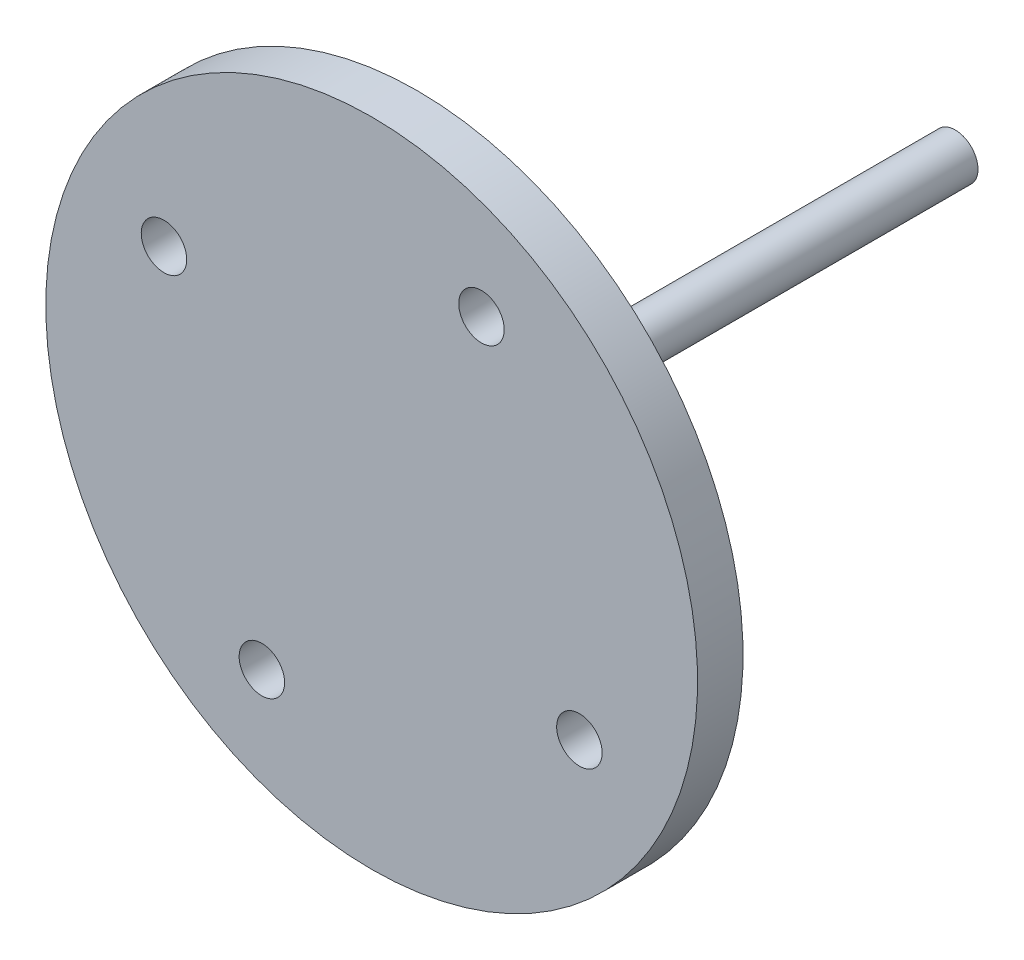
ISO-10303-21;
HEADER;
FILE_DESCRIPTION(('STEP AP214'),'2;1');
FILE_NAME('part.step','',(''),(''),'','','');
FILE_SCHEMA(('AUTOMOTIVE_DESIGN { 1 0 10303 214 1 1 1 1 }'));
ENDSEC;
DATA;
#1=APPLICATION_CONTEXT('core data for automotive mechanical design processes');
#2=APPLICATION_PROTOCOL_DEFINITION('international standard','automotive_design',2000,#1);
#3=PRODUCT_CONTEXT('',#1,'mechanical');
#4=PRODUCT('Part','Part','',(#3));
#5=PRODUCT_RELATED_PRODUCT_CATEGORY('part','',(#4));
#6=PRODUCT_DEFINITION_FORMATION('','',#4);
#7=PRODUCT_DEFINITION_CONTEXT('part definition',#1,'design');
#8=PRODUCT_DEFINITION('design','',#6,#7);
#9=PRODUCT_DEFINITION_SHAPE('','',#8);
#10=(LENGTH_UNIT() NAMED_UNIT(*) SI_UNIT(.MILLI.,.METRE.));
#11=(NAMED_UNIT(*) PLANE_ANGLE_UNIT() SI_UNIT($,.RADIAN.));
#12=(NAMED_UNIT(*) SI_UNIT($,.STERADIAN.) SOLID_ANGLE_UNIT());
#13=UNCERTAINTY_MEASURE_WITH_UNIT(LENGTH_MEASURE(1.E-05),#10,'distance_accuracy_value','');
#14=(GEOMETRIC_REPRESENTATION_CONTEXT(3) GLOBAL_UNCERTAINTY_ASSIGNED_CONTEXT((#13)) GLOBAL_UNIT_ASSIGNED_CONTEXT((#10,
#11,#12)) REPRESENTATION_CONTEXT('',''));
#15=CARTESIAN_POINT('',(0.,0.,0.));
#16=DIRECTION('',(0.,0.,1.));
#17=DIRECTION('',(1.,0.,0.));
#18=AXIS2_PLACEMENT_3D('',#15,#16,#17);
#19=CARTESIAN_POINT('',(-3.81052299673226,56.3058963351773,-35.0440010889306));
#20=DIRECTION('',(0.,0.,1.));
#21=DIRECTION('',(0.,-1.,0.));
#22=AXIS2_PLACEMENT_3D('',#19,#20,#21);
#23=CYLINDRICAL_SURFACE('',#22,21.5);
#24=CARTESIAN_POINT('',(-3.81052299673226,56.3058963351773,-35.0440010889306));
#25=DIRECTION('',(0.,0.,1.));
#26=DIRECTION('',(0.,-1.,0.));
#27=AXIS2_PLACEMENT_3D('',#24,#25,#26);
#28=CIRCLE('',#27,21.5);
#29=CARTESIAN_POINT('',(-3.81052299673226,34.8058963351773,-35.0440010889306));
#30=VERTEX_POINT('',#29);
#31=EDGE_CURVE('E41',#30,#30,#28,.T.);
#32=ORIENTED_EDGE('',*,*,#31,.T.);
#33=EDGE_LOOP('',(#32));
#34=FACE_BOUND('',#33,.T.);
#35=CARTESIAN_POINT('',(-3.81052299673226,56.3058963351773,-32.0440010889306));
#36=DIRECTION('',(0.,0.,1.));
#37=DIRECTION('',(0.,-1.,0.));
#38=AXIS2_PLACEMENT_3D('',#35,#36,#37);
#39=CIRCLE('',#38,21.5);
#40=CARTESIAN_POINT('',(-3.81052299673226,34.8058963351773,-32.0440010889306));
#41=VERTEX_POINT('',#40);
#42=EDGE_CURVE('E45',#41,#41,#39,.T.);
#43=ORIENTED_EDGE('',*,*,#42,.F.);
#44=EDGE_LOOP('',(#43));
#45=FACE_BOUND('',#44,.T.);
#46=ADVANCED_FACE('F35',(#34,#45),#23,.T.);
#47=CARTESIAN_POINT('',(-3.81052299673226,56.3058963351773,-35.0440010889306));
#48=DIRECTION('',(0.,0.,1.));
#49=DIRECTION('',(0.,-1.,0.));
#50=AXIS2_PLACEMENT_3D('',#47,#48,#49);
#51=PLANE('',#50);
#52=CARTESIAN_POINT('',(-3.81052299673226,56.3058963351773,-35.0440010889306));
#53=DIRECTION('',(0.,0.,1.));
#54=DIRECTION('',(0.,-1.,0.));
#55=AXIS2_PLACEMENT_3D('',#52,#53,#54);
#56=CIRCLE('',#55,1.5);
#57=CARTESIAN_POINT('',(-3.81052299673226,54.8058963351773,-35.0440010889306));
#58=VERTEX_POINT('',#57);
#59=EDGE_CURVE('E10',#58,#58,#56,.F.);
#60=ORIENTED_EDGE('',*,*,#59,.F.);
#61=EDGE_LOOP('',(#60));
#62=FACE_BOUND('',#61,.T.);
#63=CARTESIAN_POINT('',(3.43329133185823,70.009076767942,-35.0440010889306));
#64=DIRECTION('',(0.,0.,1.));
#65=DIRECTION('',(0.,-1.,0.));
#66=AXIS2_PLACEMENT_3D('',#63,#64,#65);
#67=CIRCLE('',#66,1.5);
#68=CARTESIAN_POINT('',(3.43329133185823,68.509076767942,-35.0440010889306));
#69=VERTEX_POINT('',#68);
#70=EDGE_CURVE('E67',#69,#69,#67,.T.);
#71=ORIENTED_EDGE('',*,*,#70,.T.);
#72=EDGE_LOOP('',(#71));
#73=FACE_BOUND('',#72,.T.);
#74=CARTESIAN_POINT('',(-17.513703429497,63.5497106637678,-35.0440010889306));
#75=DIRECTION('',(0.,0.,1.));
#76=DIRECTION('',(0.,-1.,0.));
#77=AXIS2_PLACEMENT_3D('',#74,#75,#76);
#78=CIRCLE('',#77,1.5);
#79=CARTESIAN_POINT('',(-17.513703429497,62.0497106637678,-35.0440010889306));
#80=VERTEX_POINT('',#79);
#81=EDGE_CURVE('E61',#80,#80,#78,.T.);
#82=ORIENTED_EDGE('',*,*,#81,.T.);
#83=EDGE_LOOP('',(#82));
#84=FACE_BOUND('',#83,.T.);
#85=CARTESIAN_POINT('',(-11.0543373253228,42.6027159024125,-35.0440010889306));
#86=DIRECTION('',(0.,0.,1.));
#87=DIRECTION('',(0.,-1.,0.));
#88=AXIS2_PLACEMENT_3D('',#85,#86,#87);
#89=CIRCLE('',#88,1.5);
#90=CARTESIAN_POINT('',(-11.0543373253228,41.1027159024125,-35.0440010889306));
#91=VERTEX_POINT('',#90);
#92=EDGE_CURVE('E55',#91,#91,#89,.T.);
#93=ORIENTED_EDGE('',*,*,#92,.T.);
#94=EDGE_LOOP('',(#93));
#95=FACE_BOUND('',#94,.T.);
#96=CARTESIAN_POINT('',(9.8926574360325,49.0620820065868,-35.0440010889306));
#97=DIRECTION('',(0.,0.,1.));
#98=DIRECTION('',(0.,-1.,0.));
#99=AXIS2_PLACEMENT_3D('',#96,#97,#98);
#100=CIRCLE('',#99,1.5);
#101=CARTESIAN_POINT('',(9.8926574360325,47.5620820065868,-35.0440010889306));
#102=VERTEX_POINT('',#101);
#103=EDGE_CURVE('E50',#102,#102,#100,.T.);
#104=ORIENTED_EDGE('',*,*,#103,.T.);
#105=EDGE_LOOP('',(#104));
#106=FACE_BOUND('',#105,.T.);
#107=ORIENTED_EDGE('',*,*,#31,.F.);
#108=EDGE_LOOP('',(#107));
#109=FACE_BOUND('',#108,.T.);
#110=ADVANCED_FACE('F94',(#62,#73,#84,#95,#106,#109),#51,.F.);
#111=CARTESIAN_POINT('',(-3.81052299673226,56.3058963351773,-32.0440010889306));
#112=DIRECTION('',(0.,0.,1.));
#113=DIRECTION('',(0.,-1.,0.));
#114=AXIS2_PLACEMENT_3D('',#111,#112,#113);
#115=PLANE('',#114);
#116=CARTESIAN_POINT('',(3.43329133185823,70.009076767942,-32.0440010889306));
#117=DIRECTION('',(0.,0.,1.));
#118=DIRECTION('',(0.,-1.,0.));
#119=AXIS2_PLACEMENT_3D('',#116,#117,#118);
#120=CIRCLE('',#119,1.5);
#121=CARTESIAN_POINT('',(3.43329133185823,68.509076767942,-32.0440010889306));
#122=VERTEX_POINT('',#121);
#123=EDGE_CURVE('E70',#122,#122,#120,.T.);
#124=ORIENTED_EDGE('',*,*,#123,.F.);
#125=EDGE_LOOP('',(#124));
#126=FACE_BOUND('',#125,.T.);
#127=CARTESIAN_POINT('',(-17.513703429497,63.5497106637678,-32.0440010889306));
#128=DIRECTION('',(0.,0.,1.));
#129=DIRECTION('',(0.,-1.,0.));
#130=AXIS2_PLACEMENT_3D('',#127,#128,#129);
#131=CIRCLE('',#130,1.5);
#132=CARTESIAN_POINT('',(-17.513703429497,62.0497106637678,-32.0440010889306));
#133=VERTEX_POINT('',#132);
#134=EDGE_CURVE('E64',#133,#133,#131,.T.);
#135=ORIENTED_EDGE('',*,*,#134,.F.);
#136=EDGE_LOOP('',(#135));
#137=FACE_BOUND('',#136,.T.);
#138=CARTESIAN_POINT('',(-11.0543373253228,42.6027159024125,-32.0440010889306));
#139=DIRECTION('',(0.,0.,1.));
#140=DIRECTION('',(0.,-1.,0.));
#141=AXIS2_PLACEMENT_3D('',#138,#139,#140);
#142=CIRCLE('',#141,1.5);
#143=CARTESIAN_POINT('',(-11.0543373253228,41.1027159024125,-32.0440010889306));
#144=VERTEX_POINT('',#143);
#145=EDGE_CURVE('E58',#144,#144,#142,.T.);
#146=ORIENTED_EDGE('',*,*,#145,.F.);
#147=EDGE_LOOP('',(#146));
#148=FACE_BOUND('',#147,.T.);
#149=CARTESIAN_POINT('',(9.8926574360325,49.0620820065868,-32.0440010889306));
#150=DIRECTION('',(0.,0.,1.));
#151=DIRECTION('',(0.,-1.,0.));
#152=AXIS2_PLACEMENT_3D('',#149,#150,#151);
#153=CIRCLE('',#152,1.5);
#154=CARTESIAN_POINT('',(9.8926574360325,47.5620820065868,-32.0440010889306));
#155=VERTEX_POINT('',#154);
#156=EDGE_CURVE('E52',#155,#155,#153,.T.);
#157=ORIENTED_EDGE('',*,*,#156,.F.);
#158=EDGE_LOOP('',(#157));
#159=FACE_BOUND('',#158,.T.);
#160=ORIENTED_EDGE('',*,*,#42,.T.);
#161=EDGE_LOOP('',(#160));
#162=FACE_BOUND('',#161,.T.);
#163=ADVANCED_FACE('F98',(#126,#137,#148,#159,#162),#115,.T.);
#164=CARTESIAN_POINT('',(9.8926574360325,49.0620820065868,-35.0440010889306));
#165=DIRECTION('',(0.,0.,1.));
#166=DIRECTION('',(0.,-1.,0.));
#167=AXIS2_PLACEMENT_3D('',#164,#165,#166);
#168=CYLINDRICAL_SURFACE('',#167,1.5);
#169=ORIENTED_EDGE('',*,*,#103,.F.);
#170=EDGE_LOOP('',(#169));
#171=FACE_BOUND('',#170,.T.);
#172=ORIENTED_EDGE('',*,*,#156,.T.);
#173=EDGE_LOOP('',(#172));
#174=FACE_BOUND('',#173,.T.);
#175=ADVANCED_FACE('F105',(#171,#174),#168,.F.);
#176=CARTESIAN_POINT('',(-11.0543373253228,42.6027159024125,-35.0440010889306));
#177=DIRECTION('',(0.,0.,1.));
#178=DIRECTION('',(0.,-1.,0.));
#179=AXIS2_PLACEMENT_3D('',#176,#177,#178);
#180=CYLINDRICAL_SURFACE('',#179,1.5);
#181=ORIENTED_EDGE('',*,*,#92,.F.);
#182=EDGE_LOOP('',(#181));
#183=FACE_BOUND('',#182,.T.);
#184=ORIENTED_EDGE('',*,*,#145,.T.);
#185=EDGE_LOOP('',(#184));
#186=FACE_BOUND('',#185,.T.);
#187=ADVANCED_FACE('F110',(#183,#186),#180,.F.);
#188=CARTESIAN_POINT('',(-17.513703429497,63.5497106637678,-35.0440010889306));
#189=DIRECTION('',(0.,0.,1.));
#190=DIRECTION('',(0.,-1.,0.));
#191=AXIS2_PLACEMENT_3D('',#188,#189,#190);
#192=CYLINDRICAL_SURFACE('',#191,1.5);
#193=ORIENTED_EDGE('',*,*,#81,.F.);
#194=EDGE_LOOP('',(#193));
#195=FACE_BOUND('',#194,.T.);
#196=ORIENTED_EDGE('',*,*,#134,.T.);
#197=EDGE_LOOP('',(#196));
#198=FACE_BOUND('',#197,.T.);
#199=ADVANCED_FACE('F90',(#195,#198),#192,.F.);
#200=CARTESIAN_POINT('',(3.43329133185823,70.009076767942,-35.0440010889306));
#201=DIRECTION('',(0.,0.,1.));
#202=DIRECTION('',(0.,-1.,0.));
#203=AXIS2_PLACEMENT_3D('',#200,#201,#202);
#204=CYLINDRICAL_SURFACE('',#203,1.5);
#205=ORIENTED_EDGE('',*,*,#70,.F.);
#206=EDGE_LOOP('',(#205));
#207=FACE_BOUND('',#206,.T.);
#208=ORIENTED_EDGE('',*,*,#123,.T.);
#209=EDGE_LOOP('',(#208));
#210=FACE_BOUND('',#209,.T.);
#211=ADVANCED_FACE('F83',(#207,#210),#204,.F.);
#212=CARTESIAN_POINT('',(-3.81052299673226,56.3058963351773,-70.5440010889306));
#213=DIRECTION('',(0.,0.,1.));
#214=DIRECTION('',(0.,-1.,0.));
#215=AXIS2_PLACEMENT_3D('',#212,#213,#214);
#216=CYLINDRICAL_SURFACE('',#215,1.5);
#217=CARTESIAN_POINT('',(-3.81052299673226,56.3058963351773,-70.5440010889306));
#218=DIRECTION('',(0.,0.,-1.));
#219=DIRECTION('',(0.,1.,0.));
#220=AXIS2_PLACEMENT_3D('',#217,#218,#219);
#221=CIRCLE('',#220,1.5);
#222=CARTESIAN_POINT('',(-3.81052299673226,57.8058963351773,-70.5440010889306));
#223=VERTEX_POINT('',#222);
#224=EDGE_CURVE('E73',#223,#223,#221,.T.);
#225=ORIENTED_EDGE('',*,*,#224,.F.);
#226=EDGE_LOOP('',(#225));
#227=FACE_BOUND('',#226,.T.);
#228=ORIENTED_EDGE('',*,*,#59,.T.);
#229=EDGE_LOOP('',(#228));
#230=FACE_BOUND('',#229,.T.);
#231=ADVANCED_FACE('F81',(#227,#230),#216,.T.);
#232=CARTESIAN_POINT('',(-3.81052299673226,56.3058963351773,-70.5440010889306));
#233=DIRECTION('',(0.,0.,-1.));
#234=DIRECTION('',(0.,1.,0.));
#235=AXIS2_PLACEMENT_3D('',#232,#233,#234);
#236=PLANE('',#235);
#237=ORIENTED_EDGE('',*,*,#224,.T.);
#238=EDGE_LOOP('',(#237));
#239=FACE_BOUND('',#238,.T.);
#240=ADVANCED_FACE('F79',(#239),#236,.T.);
#241=CLOSED_SHELL('',(#46,#110,#163,#175,#187,#199,#211,#231,#240));
#242=MANIFOLD_SOLID_BREP('B2',#241);
#243=ADVANCED_BREP_SHAPE_REPRESENTATION('',(#18,#242),#14);
#244=SHAPE_DEFINITION_REPRESENTATION(#9,#243);
ENDSEC;
END-ISO-10303-21;
